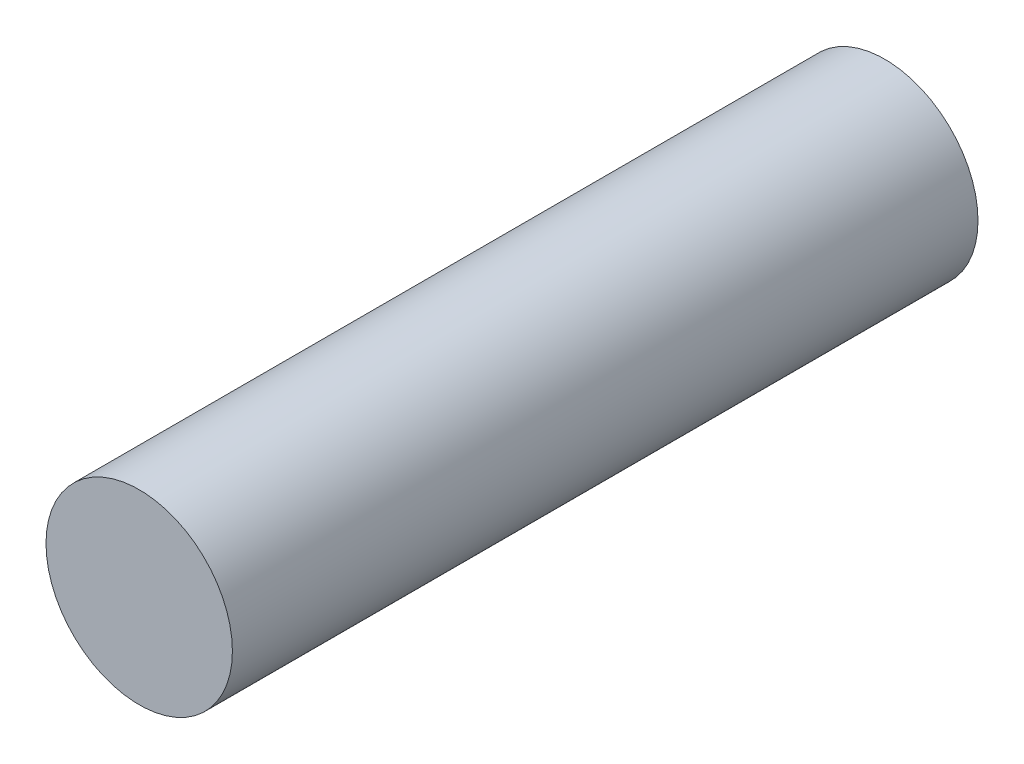
ISO-10303-21;
HEADER;
FILE_DESCRIPTION(('STEP AP214'),'2;1');
FILE_NAME('part.step','',(''),(''),'','','');
FILE_SCHEMA(('AUTOMOTIVE_DESIGN { 1 0 10303 214 1 1 1 1 }'));
ENDSEC;
DATA;
#1=APPLICATION_CONTEXT('core data for automotive mechanical design processes');
#2=APPLICATION_PROTOCOL_DEFINITION('international standard','automotive_design',2000,#1);
#3=PRODUCT_CONTEXT('',#1,'mechanical');
#4=PRODUCT('Part','Part','',(#3));
#5=PRODUCT_RELATED_PRODUCT_CATEGORY('part','',(#4));
#6=PRODUCT_DEFINITION_FORMATION('','',#4);
#7=PRODUCT_DEFINITION_CONTEXT('part definition',#1,'design');
#8=PRODUCT_DEFINITION('design','',#6,#7);
#9=PRODUCT_DEFINITION_SHAPE('','',#8);
#10=(LENGTH_UNIT() NAMED_UNIT(*) SI_UNIT(.MILLI.,.METRE.));
#11=(NAMED_UNIT(*) PLANE_ANGLE_UNIT() SI_UNIT($,.RADIAN.));
#12=(NAMED_UNIT(*) SI_UNIT($,.STERADIAN.) SOLID_ANGLE_UNIT());
#13=UNCERTAINTY_MEASURE_WITH_UNIT(LENGTH_MEASURE(1.E-05),#10,'distance_accuracy_value','');
#14=(GEOMETRIC_REPRESENTATION_CONTEXT(3) GLOBAL_UNCERTAINTY_ASSIGNED_CONTEXT((#13)) GLOBAL_UNIT_ASSIGNED_CONTEXT((#10,
#11,#12)) REPRESENTATION_CONTEXT('',''));
#15=CARTESIAN_POINT('',(0.,0.,0.));
#16=DIRECTION('',(0.,0.,1.));
#17=DIRECTION('',(1.,0.,0.));
#18=AXIS2_PLACEMENT_3D('',#15,#16,#17);
#19=CARTESIAN_POINT('',(0.,0.,3.175));
#20=DIRECTION('',(0.,0.,-1.));
#21=DIRECTION('',(-1.,0.,0.));
#22=AXIS2_PLACEMENT_3D('',#19,#20,#21);
#23=CYLINDRICAL_SURFACE('',#22,0.79375);
#24=CARTESIAN_POINT('',(0.,0.,3.175));
#25=DIRECTION('',(0.,0.,1.));
#26=DIRECTION('',(1.,0.,0.));
#27=AXIS2_PLACEMENT_3D('',#24,#25,#26);
#28=CIRCLE('',#27,0.79375);
#29=CARTESIAN_POINT('',(0.79375,0.,3.175));
#30=VERTEX_POINT('',#29);
#31=EDGE_CURVE('E10',#30,#30,#28,.T.);
#32=ORIENTED_EDGE('',*,*,#31,.F.);
#33=EDGE_LOOP('',(#32));
#34=FACE_BOUND('',#33,.T.);
#35=CARTESIAN_POINT('',(0.,0.,-3.175));
#36=DIRECTION('',(0.,0.,1.));
#37=DIRECTION('',(1.,0.,0.));
#38=AXIS2_PLACEMENT_3D('',#35,#36,#37);
#39=CIRCLE('',#38,0.79375);
#40=CARTESIAN_POINT('',(0.79375,0.,-3.175));
#41=VERTEX_POINT('',#40);
#42=EDGE_CURVE('E40',#41,#41,#39,.T.);
#43=ORIENTED_EDGE('',*,*,#42,.T.);
#44=EDGE_LOOP('',(#43));
#45=FACE_BOUND('',#44,.T.);
#46=ADVANCED_FACE('F37',(#34,#45),#23,.T.);
#47=CARTESIAN_POINT('',(0.,0.,3.175));
#48=DIRECTION('',(0.,0.,1.));
#49=DIRECTION('',(1.,0.,0.));
#50=AXIS2_PLACEMENT_3D('',#47,#48,#49);
#51=PLANE('',#50);
#52=ORIENTED_EDGE('',*,*,#31,.T.);
#53=EDGE_LOOP('',(#52));
#54=FACE_BOUND('',#53,.T.);
#55=ADVANCED_FACE('F52',(#54),#51,.T.);
#56=CARTESIAN_POINT('',(0.,0.,-3.175));
#57=DIRECTION('',(0.,0.,1.));
#58=DIRECTION('',(1.,0.,0.));
#59=AXIS2_PLACEMENT_3D('',#56,#57,#58);
#60=PLANE('',#59);
#61=ORIENTED_EDGE('',*,*,#42,.F.);
#62=EDGE_LOOP('',(#61));
#63=FACE_BOUND('',#62,.T.);
#64=ADVANCED_FACE('F50',(#63),#60,.F.);
#65=CLOSED_SHELL('',(#46,#55,#64));
#66=MANIFOLD_SOLID_BREP('B2',#65);
#67=ADVANCED_BREP_SHAPE_REPRESENTATION('',(#18,#66),#14);
#68=SHAPE_DEFINITION_REPRESENTATION(#9,#67);
ENDSEC;
END-ISO-10303-21;
